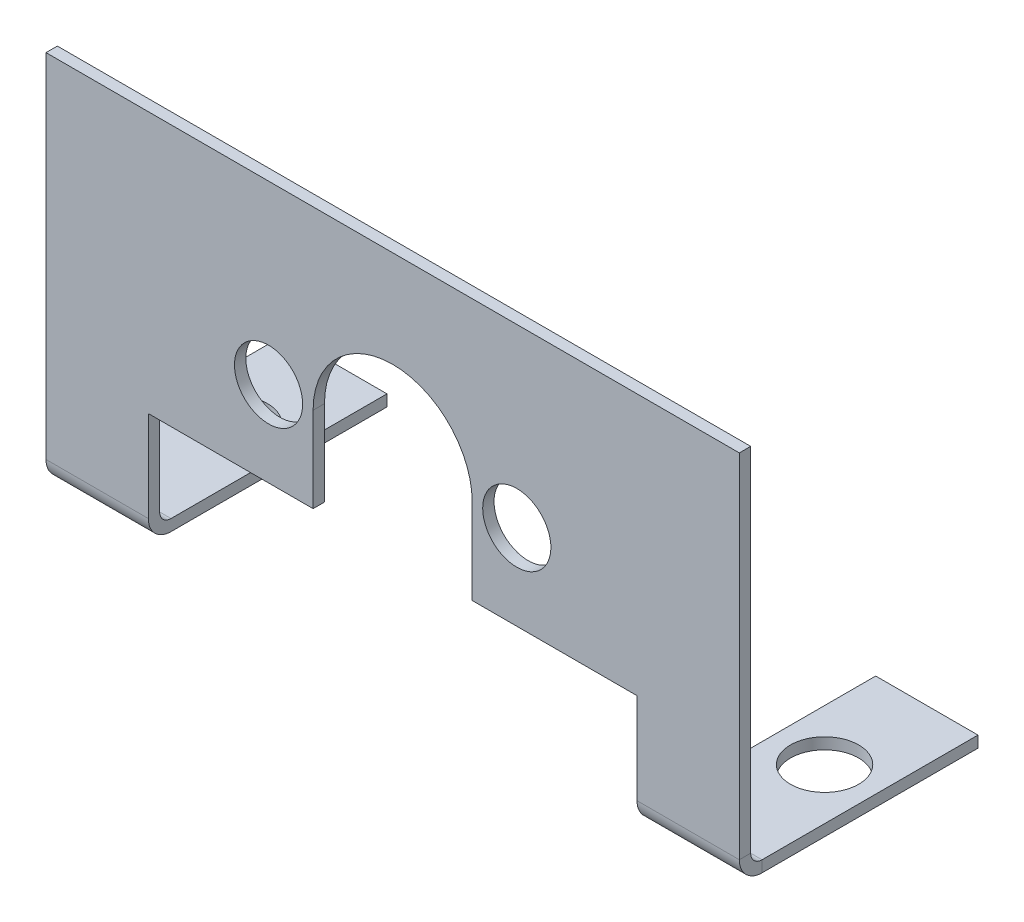
ISO-10303-21;
HEADER;
FILE_DESCRIPTION(('STEP AP214'),'2;1');
FILE_NAME('part.step','',(''),(''),'','','');
FILE_SCHEMA(('AUTOMOTIVE_DESIGN { 1 0 10303 214 1 1 1 1 }'));
ENDSEC;
DATA;
#1=APPLICATION_CONTEXT('core data for automotive mechanical design processes');
#2=APPLICATION_PROTOCOL_DEFINITION('international standard','automotive_design',2000,#1);
#3=PRODUCT_CONTEXT('',#1,'mechanical');
#4=PRODUCT('Part','Part','',(#3));
#5=PRODUCT_RELATED_PRODUCT_CATEGORY('part','',(#4));
#6=PRODUCT_DEFINITION_FORMATION('','',#4);
#7=PRODUCT_DEFINITION_CONTEXT('part definition',#1,'design');
#8=PRODUCT_DEFINITION('design','',#6,#7);
#9=PRODUCT_DEFINITION_SHAPE('','',#8);
#10=(LENGTH_UNIT() NAMED_UNIT(*) SI_UNIT(.MILLI.,.METRE.));
#11=(NAMED_UNIT(*) PLANE_ANGLE_UNIT() SI_UNIT($,.RADIAN.));
#12=(NAMED_UNIT(*) SI_UNIT($,.STERADIAN.) SOLID_ANGLE_UNIT());
#13=UNCERTAINTY_MEASURE_WITH_UNIT(LENGTH_MEASURE(1.E-05),#10,'distance_accuracy_value','');
#14=(GEOMETRIC_REPRESENTATION_CONTEXT(3) GLOBAL_UNCERTAINTY_ASSIGNED_CONTEXT((#13)) GLOBAL_UNIT_ASSIGNED_CONTEXT((#10,
#11,#12)) REPRESENTATION_CONTEXT('',''));
#15=CARTESIAN_POINT('',(0.,0.,0.));
#16=DIRECTION('',(0.,0.,1.));
#17=DIRECTION('',(1.,0.,0.));
#18=AXIS2_PLACEMENT_3D('',#15,#16,#17);
#19=CARTESIAN_POINT('',(30.5,-17.9852622673435,59.7249407783418));
#20=DIRECTION('',(0.,1.,0.));
#21=DIRECTION('',(0.,0.,1.));
#22=AXIS2_PLACEMENT_3D('',#19,#20,#21);
#23=PLANE('',#22);
#24=CARTESIAN_POINT('',(28.25,-17.9852622673435,54.2249407783418));
#25=DIRECTION('',(0.,1.,0.));
#26=DIRECTION('',(0.,0.,1.));
#27=AXIS2_PLACEMENT_3D('',#24,#25,#26);
#28=CIRCLE('',#27,1.5);
#29=CARTESIAN_POINT('',(28.25,-17.9852622673435,55.7249407783418));
#30=VERTEX_POINT('',#29);
#31=EDGE_CURVE('E409',#30,#30,#28,.T.);
#32=ORIENTED_EDGE('',*,*,#31,.T.);
#33=EDGE_LOOP('',(#32));
#34=FACE_BOUND('',#33,.T.);
#35=DIRECTION('',(-1.,0.,0.));
#36=VECTOR('',#35,1.);
#37=CARTESIAN_POINT('',(30.5,-17.9852622673435,59.2249407783418));
#38=LINE('',#37,#36);
#39=CARTESIAN_POINT('',(30.5,-17.9852622673435,59.2249407783418));
#40=VERTEX_POINT('',#39);
#41=CARTESIAN_POINT('',(26.,-17.9852622673435,59.2249407783418));
#42=VERTEX_POINT('',#41);
#43=EDGE_CURVE('E184',#40,#42,#38,.T.);
#44=ORIENTED_EDGE('',*,*,#43,.T.);
#45=DIRECTION('',(0.,0.,1.));
#46=VECTOR('',#45,1.);
#47=CARTESIAN_POINT('',(26.,-17.9852622673435,48.2249407783418));
#48=LINE('',#47,#46);
#49=CARTESIAN_POINT('',(26.,-17.9852622673435,49.7249407783418));
#50=VERTEX_POINT('',#49);
#51=EDGE_CURVE('E450',#50,#42,#48,.T.);
#52=ORIENTED_EDGE('',*,*,#51,.F.);
#53=DIRECTION('',(-1.,0.,0.));
#54=VECTOR('',#53,1.);
#55=CARTESIAN_POINT('',(30.5,-17.9852622673435,49.7249407783418));
#56=LINE('',#55,#54);
#57=CARTESIAN_POINT('',(30.5,-17.9852622673435,49.7249407783418));
#58=VERTEX_POINT('',#57);
#59=EDGE_CURVE('E203',#58,#50,#56,.T.);
#60=ORIENTED_EDGE('',*,*,#59,.F.);
#61=DIRECTION('',(0.,0.,-1.));
#62=VECTOR('',#61,1.);
#63=CARTESIAN_POINT('',(30.5,-17.9852622673435,59.7249407783418));
#64=LINE('',#63,#62);
#65=EDGE_CURVE('E111',#40,#58,#64,.T.);
#66=ORIENTED_EDGE('',*,*,#65,.F.);
#67=EDGE_LOOP('',(#44,#52,#60,#66));
#68=FACE_BOUND('',#67,.T.);
#69=ADVANCED_FACE('F46',(#34,#68),#23,.F.);
#70=CARTESIAN_POINT('',(30.5,-17.4852622673435,49.7249407783418));
#71=DIRECTION('',(0.,0.,-1.));
#72=DIRECTION('',(-1.,0.,0.));
#73=AXIS2_PLACEMENT_3D('',#70,#71,#72);
#74=PLANE('',#73);
#75=DIRECTION('',(0.,-1.,0.));
#76=VECTOR('',#75,1.);
#77=CARTESIAN_POINT('',(26.,-17.4852622673435,49.7249407783418));
#78=LINE('',#77,#76);
#79=CARTESIAN_POINT('',(26.,-17.4852622673435,49.7249407783418));
#80=VERTEX_POINT('',#79);
#81=EDGE_CURVE('E262',#80,#50,#78,.T.);
#82=ORIENTED_EDGE('',*,*,#81,.F.);
#83=DIRECTION('',(-1.,0.,0.));
#84=VECTOR('',#83,1.);
#85=CARTESIAN_POINT('',(30.5,-17.4852622673435,49.7249407783418));
#86=LINE('',#85,#84);
#87=CARTESIAN_POINT('',(30.5,-17.4852622673435,49.7249407783418));
#88=VERTEX_POINT('',#87);
#89=EDGE_CURVE('E199',#88,#80,#86,.T.);
#90=ORIENTED_EDGE('',*,*,#89,.F.);
#91=DIRECTION('',(0.,-1.,0.));
#92=VECTOR('',#91,1.);
#93=CARTESIAN_POINT('',(30.5,-17.4852622673435,49.7249407783418));
#94=LINE('',#93,#92);
#95=EDGE_CURVE('E286',#88,#58,#94,.T.);
#96=ORIENTED_EDGE('',*,*,#95,.T.);
#97=ORIENTED_EDGE('',*,*,#59,.T.);
#98=EDGE_LOOP('',(#82,#90,#96,#97));
#99=FACE_BOUND('',#98,.T.);
#100=ADVANCED_FACE('F320',(#99),#74,.T.);
#101=CARTESIAN_POINT('',(30.5,-17.4852622673435,59.7249407783418));
#102=DIRECTION('',(0.,1.,0.));
#103=DIRECTION('',(0.,0.,1.));
#104=AXIS2_PLACEMENT_3D('',#101,#102,#103);
#105=PLANE('',#104);
#106=CARTESIAN_POINT('',(28.25,-17.4852622673435,54.2249407783418));
#107=DIRECTION('',(0.,1.,0.));
#108=DIRECTION('',(0.,0.,1.));
#109=AXIS2_PLACEMENT_3D('',#106,#107,#108);
#110=CIRCLE('',#109,1.5);
#111=CARTESIAN_POINT('',(28.25,-17.4852622673435,55.7249407783418));
#112=VERTEX_POINT('',#111);
#113=EDGE_CURVE('E406',#112,#112,#110,.T.);
#114=ORIENTED_EDGE('',*,*,#113,.F.);
#115=EDGE_LOOP('',(#114));
#116=FACE_BOUND('',#115,.T.);
#117=DIRECTION('',(0.,0.,-1.));
#118=VECTOR('',#117,1.);
#119=CARTESIAN_POINT('',(26.,-17.4852622673435,59.7249407783418));
#120=LINE('',#119,#118);
#121=CARTESIAN_POINT('',(26.,-17.4852622673435,59.2249407783418));
#122=VERTEX_POINT('',#121);
#123=EDGE_CURVE('E259',#122,#80,#120,.T.);
#124=ORIENTED_EDGE('',*,*,#123,.F.);
#125=DIRECTION('',(-1.,0.,0.));
#126=VECTOR('',#125,1.);
#127=CARTESIAN_POINT('',(30.5,-17.4852622673435,59.2249407783418));
#128=LINE('',#127,#126);
#129=CARTESIAN_POINT('',(30.5,-17.4852622673435,59.2249407783418));
#130=VERTEX_POINT('',#129);
#131=EDGE_CURVE('E195',#130,#122,#128,.T.);
#132=ORIENTED_EDGE('',*,*,#131,.F.);
#133=DIRECTION('',(0.,0.,-1.));
#134=VECTOR('',#133,1.);
#135=CARTESIAN_POINT('',(30.5,-17.4852622673435,59.7249407783418));
#136=LINE('',#135,#134);
#137=EDGE_CURVE('E289',#130,#88,#136,.T.);
#138=ORIENTED_EDGE('',*,*,#137,.T.);
#139=ORIENTED_EDGE('',*,*,#89,.T.);
#140=EDGE_LOOP('',(#124,#132,#138,#139));
#141=FACE_BOUND('',#140,.T.);
#142=ADVANCED_FACE('F325',(#116,#141),#105,.T.);
#143=CARTESIAN_POINT('',(30.5,-16.9852622673435,59.2249407783418));
#144=DIRECTION('',(-1.,0.,0.));
#145=DIRECTION('',(0.,0.,1.));
#146=AXIS2_PLACEMENT_3D('',#143,#144,#145);
#147=CYLINDRICAL_SURFACE('',#146,0.5);
#148=CARTESIAN_POINT('',(26.,-16.9852622673435,59.2249407783418));
#149=DIRECTION('',(1.,0.,0.));
#150=DIRECTION('',(0.,1.,0.));
#151=AXIS2_PLACEMENT_3D('',#148,#149,#150);
#152=CIRCLE('',#151,0.5);
#153=CARTESIAN_POINT('',(26.,-16.9852622673435,59.7249407783418));
#154=VERTEX_POINT('',#153);
#155=EDGE_CURVE('E251',#154,#122,#152,.T.);
#156=ORIENTED_EDGE('',*,*,#155,.F.);
#157=DIRECTION('',(-1.,0.,0.));
#158=VECTOR('',#157,1.);
#159=CARTESIAN_POINT('',(30.5,-16.9852622673435,59.7249407783418));
#160=LINE('',#159,#158);
#161=CARTESIAN_POINT('',(30.5,-16.9852622673435,59.7249407783418));
#162=VERTEX_POINT('',#161);
#163=EDGE_CURVE('E191',#162,#154,#160,.T.);
#164=ORIENTED_EDGE('',*,*,#163,.F.);
#165=CARTESIAN_POINT('',(30.5,-16.9852622673435,59.2249407783418));
#166=DIRECTION('',(-1.,0.,0.));
#167=DIRECTION('',(0.,0.,1.));
#168=AXIS2_PLACEMENT_3D('',#165,#166,#167);
#169=CIRCLE('',#168,0.5);
#170=EDGE_CURVE('E158',#162,#130,#169,.F.);
#171=ORIENTED_EDGE('',*,*,#170,.T.);
#172=ORIENTED_EDGE('',*,*,#131,.T.);
#173=EDGE_LOOP('',(#156,#164,#171,#172));
#174=FACE_BOUND('',#173,.T.);
#175=ADVANCED_FACE('F296',(#174),#147,.F.);
#176=CARTESIAN_POINT('',(30.5,-16.9852622673435,59.2249407783418));
#177=DIRECTION('',(-1.,0.,0.));
#178=DIRECTION('',(0.,0.,1.));
#179=AXIS2_PLACEMENT_3D('',#176,#177,#178);
#180=CYLINDRICAL_SURFACE('',#179,1.);
#181=DIRECTION('',(-1.,0.,0.));
#182=VECTOR('',#181,1.);
#183=CARTESIAN_POINT('',(30.5,-16.9852622673435,60.2249407783418));
#184=LINE('',#183,#182);
#185=CARTESIAN_POINT('',(30.5,-16.9852622673435,60.2249407783418));
#186=VERTEX_POINT('',#185);
#187=CARTESIAN_POINT('',(26.,-16.9852622673435,60.2249407783418));
#188=VERTEX_POINT('',#187);
#189=EDGE_CURVE('E140',#186,#188,#184,.T.);
#190=ORIENTED_EDGE('',*,*,#189,.T.);
#191=CARTESIAN_POINT('',(26.,-16.9852622673435,59.2249407783418));
#192=DIRECTION('',(1.,0.,0.));
#193=DIRECTION('',(0.,1.,0.));
#194=AXIS2_PLACEMENT_3D('',#191,#192,#193);
#195=CIRCLE('',#194,1.);
#196=EDGE_CURVE('E13',#188,#42,#195,.T.);
#197=ORIENTED_EDGE('',*,*,#196,.T.);
#198=ORIENTED_EDGE('',*,*,#43,.F.);
#199=CARTESIAN_POINT('',(30.5,-16.9852622673435,59.2249407783418));
#200=DIRECTION('',(1.,0.,0.));
#201=DIRECTION('',(0.,0.,-1.));
#202=AXIS2_PLACEMENT_3D('',#199,#200,#201);
#203=CIRCLE('',#202,1.);
#204=EDGE_CURVE('E151',#186,#40,#203,.T.);
#205=ORIENTED_EDGE('',*,*,#204,.F.);
#206=EDGE_LOOP('',(#190,#197,#198,#205));
#207=FACE_BOUND('',#206,.T.);
#208=ADVANCED_FACE('F350',(#207),#180,.T.);
#209=CARTESIAN_POINT('',(30.5,-17.4852622673435,59.2249407783418));
#210=DIRECTION('',(1.,0.,0.));
#211=DIRECTION('',(0.,0.,-1.));
#212=AXIS2_PLACEMENT_3D('',#209,#210,#211);
#213=PLANE('',#212);
#214=DIRECTION('',(0.,-1.,0.));
#215=VECTOR('',#214,1.);
#216=CARTESIAN_POINT('',(30.5,-17.4852622673435,59.2249407783418));
#217=LINE('',#216,#215);
#218=EDGE_CURVE('E70',#130,#40,#217,.T.);
#219=ORIENTED_EDGE('',*,*,#218,.F.);
#220=ORIENTED_EDGE('',*,*,#170,.F.);
#221=DIRECTION('',(0.,0.,-1.));
#222=VECTOR('',#221,1.);
#223=CARTESIAN_POINT('',(30.5,-16.9852622673435,60.2249407783418));
#224=LINE('',#223,#222);
#225=EDGE_CURVE('E212',#186,#162,#224,.T.);
#226=ORIENTED_EDGE('',*,*,#225,.F.);
#227=ORIENTED_EDGE('',*,*,#204,.T.);
#228=EDGE_LOOP('',(#219,#220,#226,#227));
#229=FACE_BOUND('',#228,.T.);
#230=ADVANCED_FACE('F48',(#229),#213,.T.);
#231=CARTESIAN_POINT('',(30.5,-16.9852622673435,60.2249407783418));
#232=DIRECTION('',(1.,0.,0.));
#233=DIRECTION('',(0.,0.,-1.));
#234=AXIS2_PLACEMENT_3D('',#231,#232,#233);
#235=PLANE('',#234);
#236=ORIENTED_EDGE('',*,*,#137,.F.);
#237=ORIENTED_EDGE('',*,*,#218,.T.);
#238=ORIENTED_EDGE('',*,*,#65,.T.);
#239=ORIENTED_EDGE('',*,*,#95,.F.);
#240=EDGE_LOOP('',(#236,#237,#238,#239));
#241=FACE_BOUND('',#240,.T.);
#242=ADVANCED_FACE('F317',(#241),#235,.T.);
#243=CARTESIAN_POINT('',(0.,-16.9852622673435,59.7249407783418));
#244=DIRECTION('',(-1.,0.,0.));
#245=DIRECTION('',(0.,0.,1.));
#246=AXIS2_PLACEMENT_3D('',#243,#244,#245);
#247=PLANE('',#246);
#248=DIRECTION('',(0.,0.,1.));
#249=VECTOR('',#248,1.);
#250=CARTESIAN_POINT('',(0.,-16.9852622673435,59.7249407783418));
#251=LINE('',#250,#249);
#252=CARTESIAN_POINT('',(0.,-16.9852622673435,59.7249407783418));
#253=VERTEX_POINT('',#252);
#254=CARTESIAN_POINT('',(0.,-16.9852622673435,60.2249407783418));
#255=VERTEX_POINT('',#254);
#256=EDGE_CURVE('E209',#253,#255,#251,.T.);
#257=ORIENTED_EDGE('',*,*,#256,.F.);
#258=CARTESIAN_POINT('',(0.,-16.9852622673435,59.2249407783418));
#259=DIRECTION('',(-1.,0.,0.));
#260=DIRECTION('',(0.,0.,1.));
#261=AXIS2_PLACEMENT_3D('',#258,#259,#260);
#262=CIRCLE('',#261,0.5);
#263=CARTESIAN_POINT('',(0.,-17.4852622673435,59.2249407783418));
#264=VERTEX_POINT('',#263);
#265=EDGE_CURVE('E172',#253,#264,#262,.F.);
#266=ORIENTED_EDGE('',*,*,#265,.T.);
#267=DIRECTION('',(0.,1.,0.));
#268=VECTOR('',#267,1.);
#269=CARTESIAN_POINT('',(0.,-17.9852622673435,59.2249407783418));
#270=LINE('',#269,#268);
#271=CARTESIAN_POINT('',(0.,-17.9852622673435,59.2249407783418));
#272=VERTEX_POINT('',#271);
#273=EDGE_CURVE('E206',#272,#264,#270,.T.);
#274=ORIENTED_EDGE('',*,*,#273,.F.);
#275=CARTESIAN_POINT('',(0.,-16.9852622673435,59.2249407783418));
#276=DIRECTION('',(1.,0.,0.));
#277=DIRECTION('',(0.,0.,-1.));
#278=AXIS2_PLACEMENT_3D('',#275,#276,#277);
#279=CIRCLE('',#278,1.);
#280=EDGE_CURVE('E181',#255,#272,#279,.T.);
#281=ORIENTED_EDGE('',*,*,#280,.F.);
#282=EDGE_LOOP('',(#257,#266,#274,#281));
#283=FACE_BOUND('',#282,.T.);
#284=ADVANCED_FACE('F225',(#283),#247,.T.);
#285=CARTESIAN_POINT('',(0.,-17.9852622673435,59.2249407783418));
#286=DIRECTION('',(-1.,0.,0.));
#287=DIRECTION('',(0.,0.,1.));
#288=AXIS2_PLACEMENT_3D('',#285,#286,#287);
#289=PLANE('',#288);
#290=DIRECTION('',(0.,-1.,0.));
#291=VECTOR('',#290,1.);
#292=CARTESIAN_POINT('',(0.,-1.48526226734347,59.7249407783418));
#293=LINE('',#292,#291);
#294=CARTESIAN_POINT('',(0.,-1.48526226734347,59.7249407783418));
#295=VERTEX_POINT('',#294);
#296=EDGE_CURVE('E175',#295,#253,#293,.T.);
#297=ORIENTED_EDGE('',*,*,#296,.T.);
#298=ORIENTED_EDGE('',*,*,#256,.T.);
#299=DIRECTION('',(0.,-1.,0.));
#300=VECTOR('',#299,1.);
#301=CARTESIAN_POINT('',(0.,-1.48526226734347,60.2249407783418));
#302=LINE('',#301,#300);
#303=CARTESIAN_POINT('',(0.,-1.48526226734347,60.2249407783418));
#304=VERTEX_POINT('',#303);
#305=EDGE_CURVE('E179',#304,#255,#302,.T.);
#306=ORIENTED_EDGE('',*,*,#305,.F.);
#307=DIRECTION('',(0.,0.,-1.));
#308=VECTOR('',#307,1.);
#309=CARTESIAN_POINT('',(0.,-1.48526226734347,60.2249407783418));
#310=LINE('',#309,#308);
#311=EDGE_CURVE('E135',#304,#295,#310,.T.);
#312=ORIENTED_EDGE('',*,*,#311,.T.);
#313=EDGE_LOOP('',(#297,#298,#306,#312));
#314=FACE_BOUND('',#313,.T.);
#315=ADVANCED_FACE('F308',(#314),#289,.T.);
#316=CARTESIAN_POINT('',(2.25,-17.9852622673435,54.2249407783418));
#317=DIRECTION('',(0.,1.,0.));
#318=DIRECTION('',(0.,0.,1.));
#319=AXIS2_PLACEMENT_3D('',#316,#317,#318);
#320=CIRCLE('',#319,1.5);
#321=CARTESIAN_POINT('',(2.25,-17.9852622673435,55.7249407783418));
#322=VERTEX_POINT('',#321);
#323=EDGE_CURVE('E405',#322,#322,#320,.T.);
#324=ORIENTED_EDGE('',*,*,#323,.T.);
#325=EDGE_LOOP('',(#324));
#326=FACE_BOUND('',#325,.T.);
#327=CARTESIAN_POINT('',(4.5,-17.9852622673435,49.7249407783418));
#328=VERTEX_POINT('',#327);
#329=CARTESIAN_POINT('',(0.,-17.9852622673435,49.7249407783418));
#330=VERTEX_POINT('',#329);
#331=EDGE_CURVE('E202',#328,#330,#56,.T.);
#332=ORIENTED_EDGE('',*,*,#331,.F.);
#333=DIRECTION('',(0.,0.,1.));
#334=VECTOR('',#333,1.);
#335=CARTESIAN_POINT('',(4.5,-17.9852622673435,48.2249407783418));
#336=LINE('',#335,#334);
#337=CARTESIAN_POINT('',(4.5,-17.9852622673435,59.2249407783418));
#338=VERTEX_POINT('',#337);
#339=EDGE_CURVE('E235',#328,#338,#336,.T.);
#340=ORIENTED_EDGE('',*,*,#339,.T.);
#341=EDGE_CURVE('E105',#338,#272,#38,.T.);
#342=ORIENTED_EDGE('',*,*,#341,.T.);
#343=DIRECTION('',(0.,0.,-1.));
#344=VECTOR('',#343,1.);
#345=CARTESIAN_POINT('',(0.,-17.9852622673435,59.7249407783418));
#346=LINE('',#345,#344);
#347=EDGE_CURVE('E163',#272,#330,#346,.T.);
#348=ORIENTED_EDGE('',*,*,#347,.T.);
#349=EDGE_LOOP('',(#332,#340,#342,#348));
#350=FACE_BOUND('',#349,.T.);
#351=ADVANCED_FACE('F233',(#326,#350),#23,.F.);
#352=DIRECTION('',(0.,1.,0.));
#353=VECTOR('',#352,1.);
#354=CARTESIAN_POINT('',(4.5,-17.4852622673435,49.7249407783418));
#355=LINE('',#354,#353);
#356=CARTESIAN_POINT('',(4.5,-17.4852622673435,49.7249407783418));
#357=VERTEX_POINT('',#356);
#358=EDGE_CURVE('E243',#328,#357,#355,.T.);
#359=ORIENTED_EDGE('',*,*,#358,.F.);
#360=ORIENTED_EDGE('',*,*,#331,.T.);
#361=DIRECTION('',(0.,-1.,0.));
#362=VECTOR('',#361,1.);
#363=CARTESIAN_POINT('',(0.,-17.4852622673435,49.7249407783418));
#364=LINE('',#363,#362);
#365=CARTESIAN_POINT('',(0.,-17.4852622673435,49.7249407783418));
#366=VERTEX_POINT('',#365);
#367=EDGE_CURVE('E165',#366,#330,#364,.T.);
#368=ORIENTED_EDGE('',*,*,#367,.F.);
#369=EDGE_CURVE('E198',#357,#366,#86,.T.);
#370=ORIENTED_EDGE('',*,*,#369,.F.);
#371=EDGE_LOOP('',(#359,#360,#368,#370));
#372=FACE_BOUND('',#371,.T.);
#373=ADVANCED_FACE('F240',(#372),#74,.T.);
#374=CARTESIAN_POINT('',(2.25,-17.4852622673435,54.2249407783418));
#375=DIRECTION('',(0.,1.,0.));
#376=DIRECTION('',(0.,0.,-1.));
#377=AXIS2_PLACEMENT_3D('',#374,#375,#376);
#378=CIRCLE('',#377,1.5);
#379=CARTESIAN_POINT('',(2.25,-17.4852622673435,52.7249407783418));
#380=VERTEX_POINT('',#379);
#381=EDGE_CURVE('E402',#380,#380,#378,.T.);
#382=ORIENTED_EDGE('',*,*,#381,.F.);
#383=EDGE_LOOP('',(#382));
#384=FACE_BOUND('',#383,.T.);
#385=DIRECTION('',(0.,0.,1.));
#386=VECTOR('',#385,1.);
#387=CARTESIAN_POINT('',(4.5,-17.4852622673435,59.7249407783418));
#388=LINE('',#387,#386);
#389=CARTESIAN_POINT('',(4.5,-17.4852622673435,59.2249407783418));
#390=VERTEX_POINT('',#389);
#391=EDGE_CURVE('E248',#357,#390,#388,.T.);
#392=ORIENTED_EDGE('',*,*,#391,.F.);
#393=ORIENTED_EDGE('',*,*,#369,.T.);
#394=DIRECTION('',(0.,0.,-1.));
#395=VECTOR('',#394,1.);
#396=CARTESIAN_POINT('',(0.,-17.4852622673435,59.7249407783418));
#397=LINE('',#396,#395);
#398=EDGE_CURVE('E169',#264,#366,#397,.T.);
#399=ORIENTED_EDGE('',*,*,#398,.F.);
#400=EDGE_CURVE('E194',#390,#264,#128,.T.);
#401=ORIENTED_EDGE('',*,*,#400,.F.);
#402=EDGE_LOOP('',(#392,#393,#399,#401));
#403=FACE_BOUND('',#402,.T.);
#404=ADVANCED_FACE('F332',(#384,#403),#105,.T.);
#405=CARTESIAN_POINT('',(4.5,-16.9852622673435,59.2249407783418));
#406=DIRECTION('',(-1.,0.,0.));
#407=DIRECTION('',(0.,-1.,0.));
#408=AXIS2_PLACEMENT_3D('',#405,#406,#407);
#409=CIRCLE('',#408,0.5);
#410=CARTESIAN_POINT('',(4.5,-16.9852622673435,59.7249407783418));
#411=VERTEX_POINT('',#410);
#412=EDGE_CURVE('E253',#390,#411,#409,.T.);
#413=ORIENTED_EDGE('',*,*,#412,.F.);
#414=ORIENTED_EDGE('',*,*,#400,.T.);
#415=ORIENTED_EDGE('',*,*,#265,.F.);
#416=EDGE_CURVE('E190',#411,#253,#160,.T.);
#417=ORIENTED_EDGE('',*,*,#416,.F.);
#418=EDGE_LOOP('',(#413,#414,#415,#417));
#419=FACE_BOUND('',#418,.T.);
#420=ADVANCED_FACE('F335',(#419),#147,.F.);
#421=CARTESIAN_POINT('',(30.5,-1.48526226734347,59.7249407783418));
#422=DIRECTION('',(0.,0.,-1.));
#423=DIRECTION('',(0.,1.,0.));
#424=AXIS2_PLACEMENT_3D('',#421,#422,#423);
#425=PLANE('',#424);
#426=CARTESIAN_POINT('',(20.71,-9.23526226734347,59.7249407783418));
#427=DIRECTION('',(0.,0.,-1.));
#428=DIRECTION('',(0.,1.,0.));
#429=AXIS2_PLACEMENT_3D('',#426,#427,#428);
#430=CIRCLE('',#429,1.5);
#431=CARTESIAN_POINT('',(20.71,-7.73526226734347,59.7249407783418));
#432=VERTEX_POINT('',#431);
#433=EDGE_CURVE('E417',#432,#432,#430,.T.);
#434=ORIENTED_EDGE('',*,*,#433,.F.);
#435=EDGE_LOOP('',(#434));
#436=FACE_BOUND('',#435,.T.);
#437=DIRECTION('',(0.,-1.,0.));
#438=VECTOR('',#437,1.);
#439=CARTESIAN_POINT('',(26.,-1.48526226734346,59.7249407783418));
#440=LINE('',#439,#438);
#441=CARTESIAN_POINT('',(26.,-12.9852622673435,59.7249407783418));
#442=VERTEX_POINT('',#441);
#443=EDGE_CURVE('E247',#442,#154,#440,.T.);
#444=ORIENTED_EDGE('',*,*,#443,.F.);
#445=DIRECTION('',(1.,0.,0.));
#446=VECTOR('',#445,1.);
#447=CARTESIAN_POINT('',(30.5,-12.9852622673435,59.7249407783418));
#448=LINE('',#447,#446);
#449=CARTESIAN_POINT('',(18.75,-12.9852622673435,59.7249407783418));
#450=VERTEX_POINT('',#449);
#451=EDGE_CURVE('E271',#450,#442,#448,.T.);
#452=ORIENTED_EDGE('',*,*,#451,.F.);
#453=DIRECTION('',(0.,-1.,0.));
#454=VECTOR('',#453,1.);
#455=CARTESIAN_POINT('',(18.75,-1.48526226734347,59.7249407783418));
#456=LINE('',#455,#454);
#457=CARTESIAN_POINT('',(18.75,-9.23526226734347,59.7249407783418));
#458=VERTEX_POINT('',#457);
#459=EDGE_CURVE('E274',#458,#450,#456,.T.);
#460=ORIENTED_EDGE('',*,*,#459,.F.);
#461=CARTESIAN_POINT('',(15.25,-9.23526226734347,59.7249407783418));
#462=DIRECTION('',(0.,0.,-1.));
#463=DIRECTION('',(0.,1.,0.));
#464=AXIS2_PLACEMENT_3D('',#461,#462,#463);
#465=CIRCLE('',#464,3.5);
#466=CARTESIAN_POINT('',(11.75,-9.23526226734347,59.7249407783418));
#467=VERTEX_POINT('',#466);
#468=EDGE_CURVE('E277',#467,#458,#465,.T.);
#469=ORIENTED_EDGE('',*,*,#468,.F.);
#470=DIRECTION('',(0.,1.,0.));
#471=VECTOR('',#470,1.);
#472=CARTESIAN_POINT('',(11.75,-1.48526226734347,59.7249407783418));
#473=LINE('',#472,#471);
#474=CARTESIAN_POINT('',(11.75,-12.9852622673435,59.7249407783418));
#475=VERTEX_POINT('',#474);
#476=EDGE_CURVE('E265',#475,#467,#473,.T.);
#477=ORIENTED_EDGE('',*,*,#476,.F.);
#478=DIRECTION('',(1.,0.,0.));
#479=VECTOR('',#478,1.);
#480=CARTESIAN_POINT('',(30.5,-12.9852622673435,59.7249407783418));
#481=LINE('',#480,#479);
#482=CARTESIAN_POINT('',(4.5,-12.9852622673435,59.7249407783418));
#483=VERTEX_POINT('',#482);
#484=EDGE_CURVE('E268',#483,#475,#481,.T.);
#485=ORIENTED_EDGE('',*,*,#484,.F.);
#486=DIRECTION('',(0.,1.,0.));
#487=VECTOR('',#486,1.);
#488=CARTESIAN_POINT('',(4.49999999999999,-1.48526226734347,59.7249407783418));
#489=LINE('',#488,#487);
#490=EDGE_CURVE('E443',#411,#483,#489,.T.);
#491=ORIENTED_EDGE('',*,*,#490,.F.);
#492=ORIENTED_EDGE('',*,*,#416,.T.);
#493=ORIENTED_EDGE('',*,*,#296,.F.);
#494=DIRECTION('',(-1.,0.,0.));
#495=VECTOR('',#494,1.);
#496=CARTESIAN_POINT('',(30.5,-1.48526226734347,59.7249407783418));
#497=LINE('',#496,#495);
#498=CARTESIAN_POINT('',(30.5,-1.48526226734347,59.7249407783418));
#499=VERTEX_POINT('',#498);
#500=EDGE_CURVE('E139',#499,#295,#497,.T.);
#501=ORIENTED_EDGE('',*,*,#500,.F.);
#502=DIRECTION('',(0.,-1.,0.));
#503=VECTOR('',#502,1.);
#504=CARTESIAN_POINT('',(30.5,-1.48526226734347,59.7249407783418));
#505=LINE('',#504,#503);
#506=EDGE_CURVE('E156',#499,#162,#505,.T.);
#507=ORIENTED_EDGE('',*,*,#506,.T.);
#508=ORIENTED_EDGE('',*,*,#163,.T.);
#509=EDGE_LOOP('',(#444,#452,#460,#469,#477,#485,#491,#492,#493,#501,#507,#508));
#510=FACE_BOUND('',#509,.T.);
#511=CARTESIAN_POINT('',(9.79,-9.23526226734347,59.7249407783418));
#512=DIRECTION('',(0.,0.,-1.));
#513=DIRECTION('',(0.,1.,0.));
#514=AXIS2_PLACEMENT_3D('',#511,#512,#513);
#515=CIRCLE('',#514,1.5);
#516=CARTESIAN_POINT('',(9.79,-7.73526226734347,59.7249407783418));
#517=VERTEX_POINT('',#516);
#518=EDGE_CURVE('E166',#517,#517,#515,.T.);
#519=ORIENTED_EDGE('',*,*,#518,.F.);
#520=EDGE_LOOP('',(#519));
#521=FACE_BOUND('',#520,.T.);
#522=ADVANCED_FACE('F302',(#436,#510,#521),#425,.T.);
#523=CARTESIAN_POINT('',(30.5,-1.48526226734347,60.2249407783418));
#524=DIRECTION('',(0.,1.,0.));
#525=DIRECTION('',(0.,0.,1.));
#526=AXIS2_PLACEMENT_3D('',#523,#524,#525);
#527=PLANE('',#526);
#528=ORIENTED_EDGE('',*,*,#311,.F.);
#529=DIRECTION('',(-1.,0.,0.));
#530=VECTOR('',#529,1.);
#531=CARTESIAN_POINT('',(30.5,-1.48526226734347,60.2249407783418));
#532=LINE('',#531,#530);
#533=CARTESIAN_POINT('',(30.5,-1.48526226734347,60.2249407783418));
#534=VERTEX_POINT('',#533);
#535=EDGE_CURVE('E129',#534,#304,#532,.T.);
#536=ORIENTED_EDGE('',*,*,#535,.F.);
#537=DIRECTION('',(0.,0.,-1.));
#538=VECTOR('',#537,1.);
#539=CARTESIAN_POINT('',(30.5,-1.48526226734347,60.2249407783418));
#540=LINE('',#539,#538);
#541=EDGE_CURVE('E133',#534,#499,#540,.T.);
#542=ORIENTED_EDGE('',*,*,#541,.T.);
#543=ORIENTED_EDGE('',*,*,#500,.T.);
#544=EDGE_LOOP('',(#528,#536,#542,#543));
#545=FACE_BOUND('',#544,.T.);
#546=ADVANCED_FACE('F131',(#545),#527,.T.);
#547=CARTESIAN_POINT('',(30.5,-1.48526226734347,60.2249407783418));
#548=DIRECTION('',(0.,0.,-1.));
#549=DIRECTION('',(0.,1.,0.));
#550=AXIS2_PLACEMENT_3D('',#547,#548,#549);
#551=PLANE('',#550);
#552=CARTESIAN_POINT('',(20.71,-9.23526226734347,60.2249407783418));
#553=DIRECTION('',(0.,0.,1.));
#554=DIRECTION('',(-1.,0.,0.));
#555=AXIS2_PLACEMENT_3D('',#552,#553,#554);
#556=CIRCLE('',#555,1.5);
#557=CARTESIAN_POINT('',(19.21,-9.23526226734347,60.2249407783418));
#558=VERTEX_POINT('',#557);
#559=EDGE_CURVE('E414',#558,#558,#556,.T.);
#560=ORIENTED_EDGE('',*,*,#559,.F.);
#561=EDGE_LOOP('',(#560));
#562=FACE_BOUND('',#561,.T.);
#563=CARTESIAN_POINT('',(9.79,-9.23526226734347,60.2249407783418));
#564=DIRECTION('',(0.,0.,1.));
#565=DIRECTION('',(1.,0.,0.));
#566=AXIS2_PLACEMENT_3D('',#563,#564,#565);
#567=CIRCLE('',#566,1.5);
#568=CARTESIAN_POINT('',(11.29,-9.23526226734347,60.2249407783418));
#569=VERTEX_POINT('',#568);
#570=EDGE_CURVE('E280',#569,#569,#567,.T.);
#571=ORIENTED_EDGE('',*,*,#570,.F.);
#572=EDGE_LOOP('',(#571));
#573=FACE_BOUND('',#572,.T.);
#574=DIRECTION('',(-1.,0.,0.));
#575=VECTOR('',#574,1.);
#576=CARTESIAN_POINT('',(18.75,-12.9852622673435,60.2249407783418));
#577=LINE('',#576,#575);
#578=CARTESIAN_POINT('',(26.,-12.9852622673435,60.2249407783418));
#579=VERTEX_POINT('',#578);
#580=CARTESIAN_POINT('',(18.75,-12.9852622673435,60.2249407783418));
#581=VERTEX_POINT('',#580);
#582=EDGE_CURVE('E433',#579,#581,#577,.T.);
#583=ORIENTED_EDGE('',*,*,#582,.F.);
#584=DIRECTION('',(0.,1.,0.));
#585=VECTOR('',#584,1.);
#586=CARTESIAN_POINT('',(26.,-12.9852622673435,60.2249407783418));
#587=LINE('',#586,#585);
#588=EDGE_CURVE('E430',#188,#579,#587,.T.);
#589=ORIENTED_EDGE('',*,*,#588,.F.);
#590=ORIENTED_EDGE('',*,*,#189,.F.);
#591=DIRECTION('',(0.,-1.,0.));
#592=VECTOR('',#591,1.);
#593=CARTESIAN_POINT('',(30.5,-1.48526226734347,60.2249407783418));
#594=LINE('',#593,#592);
#595=EDGE_CURVE('E144',#534,#186,#594,.T.);
#596=ORIENTED_EDGE('',*,*,#595,.F.);
#597=ORIENTED_EDGE('',*,*,#535,.T.);
#598=ORIENTED_EDGE('',*,*,#305,.T.);
#599=CARTESIAN_POINT('',(4.50000000000001,-16.9852622673435,60.2249407783418));
#600=VERTEX_POINT('',#599);
#601=EDGE_CURVE('E187',#600,#255,#184,.T.);
#602=ORIENTED_EDGE('',*,*,#601,.F.);
#603=DIRECTION('',(0.,-1.,0.));
#604=VECTOR('',#603,1.);
#605=CARTESIAN_POINT('',(4.5,-12.9852622673435,60.2249407783418));
#606=LINE('',#605,#604);
#607=CARTESIAN_POINT('',(4.5,-12.9852622673435,60.2249407783418));
#608=VERTEX_POINT('',#607);
#609=EDGE_CURVE('E61',#608,#600,#606,.T.);
#610=ORIENTED_EDGE('',*,*,#609,.F.);
#611=DIRECTION('',(-1.,0.,0.));
#612=VECTOR('',#611,1.);
#613=CARTESIAN_POINT('',(11.75,-12.9852622673435,60.2249407783418));
#614=LINE('',#613,#612);
#615=CARTESIAN_POINT('',(11.75,-12.9852622673435,60.2249407783418));
#616=VERTEX_POINT('',#615);
#617=EDGE_CURVE('E426',#616,#608,#614,.T.);
#618=ORIENTED_EDGE('',*,*,#617,.F.);
#619=DIRECTION('',(0.,-1.,0.));
#620=VECTOR('',#619,1.);
#621=CARTESIAN_POINT('',(11.75,-9.23526226734347,60.2249407783418));
#622=LINE('',#621,#620);
#623=CARTESIAN_POINT('',(11.75,-9.23526226734347,60.2249407783418));
#624=VERTEX_POINT('',#623);
#625=EDGE_CURVE('E423',#624,#616,#622,.T.);
#626=ORIENTED_EDGE('',*,*,#625,.F.);
#627=CARTESIAN_POINT('',(15.25,-9.23526226734347,60.2249407783418));
#628=DIRECTION('',(0.,0.,1.));
#629=DIRECTION('',(1.,0.,0.));
#630=AXIS2_PLACEMENT_3D('',#627,#628,#629);
#631=CIRCLE('',#630,3.5);
#632=CARTESIAN_POINT('',(18.75,-9.23526226734347,60.2249407783418));
#633=VERTEX_POINT('',#632);
#634=EDGE_CURVE('E420',#633,#624,#631,.T.);
#635=ORIENTED_EDGE('',*,*,#634,.F.);
#636=DIRECTION('',(0.,1.,0.));
#637=VECTOR('',#636,1.);
#638=CARTESIAN_POINT('',(18.75,-12.9852622673435,60.2249407783418));
#639=LINE('',#638,#637);
#640=EDGE_CURVE('E436',#581,#633,#639,.T.);
#641=ORIENTED_EDGE('',*,*,#640,.F.);
#642=EDGE_LOOP('',(#583,#589,#590,#596,#597,#598,#602,#610,#618,#626,#635,#641));
#643=FACE_BOUND('',#642,.T.);
#644=ADVANCED_FACE('F146',(#562,#573,#643),#551,.F.);
#645=ORIENTED_EDGE('',*,*,#341,.F.);
#646=CARTESIAN_POINT('',(4.5,-16.9852622673435,59.2249407783418));
#647=DIRECTION('',(-1.,0.,0.));
#648=DIRECTION('',(0.,-1.,0.));
#649=AXIS2_PLACEMENT_3D('',#646,#647,#648);
#650=CIRCLE('',#649,1.);
#651=EDGE_CURVE('E54',#338,#600,#650,.T.);
#652=ORIENTED_EDGE('',*,*,#651,.T.);
#653=ORIENTED_EDGE('',*,*,#601,.T.);
#654=ORIENTED_EDGE('',*,*,#280,.T.);
#655=EDGE_LOOP('',(#645,#652,#653,#654));
#656=FACE_BOUND('',#655,.T.);
#657=ADVANCED_FACE('F216',(#656),#180,.T.);
#658=CARTESIAN_POINT('',(30.5,-16.9852622673435,59.2249407783418));
#659=DIRECTION('',(-1.,0.,0.));
#660=DIRECTION('',(0.,0.,1.));
#661=AXIS2_PLACEMENT_3D('',#658,#659,#660);
#662=PLANE('',#661);
#663=ORIENTED_EDGE('',*,*,#595,.T.);
#664=ORIENTED_EDGE('',*,*,#225,.T.);
#665=ORIENTED_EDGE('',*,*,#506,.F.);
#666=ORIENTED_EDGE('',*,*,#541,.F.);
#667=EDGE_LOOP('',(#663,#664,#665,#666));
#668=FACE_BOUND('',#667,.T.);
#669=ADVANCED_FACE('F154',(#668),#662,.F.);
#670=CARTESIAN_POINT('',(0.,-16.9852622673435,59.2249407783418));
#671=DIRECTION('',(-1.,0.,0.));
#672=DIRECTION('',(0.,0.,1.));
#673=AXIS2_PLACEMENT_3D('',#670,#671,#672);
#674=PLANE('',#673);
#675=ORIENTED_EDGE('',*,*,#347,.F.);
#676=ORIENTED_EDGE('',*,*,#273,.T.);
#677=ORIENTED_EDGE('',*,*,#398,.T.);
#678=ORIENTED_EDGE('',*,*,#367,.T.);
#679=EDGE_LOOP('',(#675,#676,#677,#678));
#680=FACE_BOUND('',#679,.T.);
#681=ADVANCED_FACE('F229',(#680),#674,.T.);
#682=CARTESIAN_POINT('',(9.79,-9.23526226734347,48.2249407783418));
#683=DIRECTION('',(0.,0.,1.));
#684=DIRECTION('',(1.,0.,0.));
#685=AXIS2_PLACEMENT_3D('',#682,#683,#684);
#686=CYLINDRICAL_SURFACE('',#685,1.5);
#687=ORIENTED_EDGE('',*,*,#518,.T.);
#688=EDGE_LOOP('',(#687));
#689=FACE_BOUND('',#688,.T.);
#690=ORIENTED_EDGE('',*,*,#570,.T.);
#691=EDGE_LOOP('',(#690));
#692=FACE_BOUND('',#691,.T.);
#693=ADVANCED_FACE('F353',(#689,#692),#686,.F.);
#694=CARTESIAN_POINT('',(26.,-12.9852622673435,48.2249407783418));
#695=DIRECTION('',(1.,0.,0.));
#696=DIRECTION('',(0.,1.,0.));
#697=AXIS2_PLACEMENT_3D('',#694,#695,#696);
#698=PLANE('',#697);
#699=ORIENTED_EDGE('',*,*,#81,.T.);
#700=ORIENTED_EDGE('',*,*,#51,.T.);
#701=ORIENTED_EDGE('',*,*,#196,.F.);
#702=ORIENTED_EDGE('',*,*,#588,.T.);
#703=DIRECTION('',(0.,0.,1.));
#704=VECTOR('',#703,1.);
#705=CARTESIAN_POINT('',(26.,-12.9852622673435,48.2249407783418));
#706=LINE('',#705,#704);
#707=EDGE_CURVE('E447',#442,#579,#706,.T.);
#708=ORIENTED_EDGE('',*,*,#707,.F.);
#709=ORIENTED_EDGE('',*,*,#443,.T.);
#710=ORIENTED_EDGE('',*,*,#155,.T.);
#711=ORIENTED_EDGE('',*,*,#123,.T.);
#712=EDGE_LOOP('',(#699,#700,#701,#702,#708,#709,#710,#711));
#713=FACE_BOUND('',#712,.T.);
#714=ADVANCED_FACE('F358',(#713),#698,.F.);
#715=CARTESIAN_POINT('',(4.5,-12.9852622673435,48.2249407783418));
#716=DIRECTION('',(-1.,0.,0.));
#717=DIRECTION('',(0.,-1.,0.));
#718=AXIS2_PLACEMENT_3D('',#715,#716,#717);
#719=PLANE('',#718);
#720=ORIENTED_EDGE('',*,*,#358,.T.);
#721=ORIENTED_EDGE('',*,*,#391,.T.);
#722=ORIENTED_EDGE('',*,*,#412,.T.);
#723=ORIENTED_EDGE('',*,*,#490,.T.);
#724=DIRECTION('',(0.,0.,1.));
#725=VECTOR('',#724,1.);
#726=CARTESIAN_POINT('',(4.5,-12.9852622673435,48.2249407783418));
#727=LINE('',#726,#725);
#728=EDGE_CURVE('E454',#483,#608,#727,.T.);
#729=ORIENTED_EDGE('',*,*,#728,.T.);
#730=ORIENTED_EDGE('',*,*,#609,.T.);
#731=ORIENTED_EDGE('',*,*,#651,.F.);
#732=ORIENTED_EDGE('',*,*,#339,.F.);
#733=EDGE_LOOP('',(#720,#721,#722,#723,#729,#730,#731,#732));
#734=FACE_BOUND('',#733,.T.);
#735=ADVANCED_FACE('F364',(#734),#719,.F.);
#736=CARTESIAN_POINT('',(15.25,-9.23526226734347,48.2249407783418));
#737=DIRECTION('',(0.,0.,1.));
#738=DIRECTION('',(1.,0.,0.));
#739=AXIS2_PLACEMENT_3D('',#736,#737,#738);
#740=CYLINDRICAL_SURFACE('',#739,3.5);
#741=ORIENTED_EDGE('',*,*,#468,.T.);
#742=DIRECTION('',(0.,0.,1.));
#743=VECTOR('',#742,1.);
#744=CARTESIAN_POINT('',(18.75,-9.23526226734347,48.2249407783418));
#745=LINE('',#744,#743);
#746=EDGE_CURVE('E440',#458,#633,#745,.T.);
#747=ORIENTED_EDGE('',*,*,#746,.T.);
#748=ORIENTED_EDGE('',*,*,#634,.T.);
#749=DIRECTION('',(0.,0.,1.));
#750=VECTOR('',#749,1.);
#751=CARTESIAN_POINT('',(11.75,-9.23526226734347,48.2249407783418));
#752=LINE('',#751,#750);
#753=EDGE_CURVE('E439',#467,#624,#752,.T.);
#754=ORIENTED_EDGE('',*,*,#753,.F.);
#755=EDGE_LOOP('',(#741,#747,#748,#754));
#756=FACE_BOUND('',#755,.T.);
#757=ADVANCED_FACE('F360',(#756),#740,.F.);
#758=CARTESIAN_POINT('',(18.75,-12.9852622673435,48.2249407783418));
#759=DIRECTION('',(1.,0.,0.));
#760=DIRECTION('',(0.,0.,-1.));
#761=AXIS2_PLACEMENT_3D('',#758,#759,#760);
#762=PLANE('',#761);
#763=ORIENTED_EDGE('',*,*,#459,.T.);
#764=DIRECTION('',(0.,0.,1.));
#765=VECTOR('',#764,1.);
#766=CARTESIAN_POINT('',(18.75,-12.9852622673435,48.2249407783418));
#767=LINE('',#766,#765);
#768=EDGE_CURVE('E444',#450,#581,#767,.T.);
#769=ORIENTED_EDGE('',*,*,#768,.T.);
#770=ORIENTED_EDGE('',*,*,#640,.T.);
#771=ORIENTED_EDGE('',*,*,#746,.F.);
#772=EDGE_LOOP('',(#763,#769,#770,#771));
#773=FACE_BOUND('',#772,.T.);
#774=ADVANCED_FACE('F363',(#773),#762,.F.);
#775=CARTESIAN_POINT('',(18.75,-12.9852622673435,48.2249407783418));
#776=DIRECTION('',(0.,1.,0.));
#777=DIRECTION('',(-1.,0.,0.));
#778=AXIS2_PLACEMENT_3D('',#775,#776,#777);
#779=PLANE('',#778);
#780=ORIENTED_EDGE('',*,*,#451,.T.);
#781=ORIENTED_EDGE('',*,*,#707,.T.);
#782=ORIENTED_EDGE('',*,*,#582,.T.);
#783=ORIENTED_EDGE('',*,*,#768,.F.);
#784=EDGE_LOOP('',(#780,#781,#782,#783));
#785=FACE_BOUND('',#784,.T.);
#786=ADVANCED_FACE('F374',(#785),#779,.F.);
#787=CARTESIAN_POINT('',(11.75,-12.9852622673435,48.2249407783418));
#788=DIRECTION('',(0.,1.,0.));
#789=DIRECTION('',(-1.,0.,0.));
#790=AXIS2_PLACEMENT_3D('',#787,#788,#789);
#791=PLANE('',#790);
#792=ORIENTED_EDGE('',*,*,#484,.T.);
#793=DIRECTION('',(0.,0.,1.));
#794=VECTOR('',#793,1.);
#795=CARTESIAN_POINT('',(11.75,-12.9852622673435,48.2249407783418));
#796=LINE('',#795,#794);
#797=EDGE_CURVE('E456',#475,#616,#796,.T.);
#798=ORIENTED_EDGE('',*,*,#797,.T.);
#799=ORIENTED_EDGE('',*,*,#617,.T.);
#800=ORIENTED_EDGE('',*,*,#728,.F.);
#801=EDGE_LOOP('',(#792,#798,#799,#800));
#802=FACE_BOUND('',#801,.T.);
#803=ADVANCED_FACE('F370',(#802),#791,.F.);
#804=CARTESIAN_POINT('',(11.75,-9.23526226734347,48.2249407783418));
#805=DIRECTION('',(-1.,0.,0.));
#806=DIRECTION('',(0.,0.,1.));
#807=AXIS2_PLACEMENT_3D('',#804,#805,#806);
#808=PLANE('',#807);
#809=ORIENTED_EDGE('',*,*,#476,.T.);
#810=ORIENTED_EDGE('',*,*,#753,.T.);
#811=ORIENTED_EDGE('',*,*,#625,.T.);
#812=ORIENTED_EDGE('',*,*,#797,.F.);
#813=EDGE_LOOP('',(#809,#810,#811,#812));
#814=FACE_BOUND('',#813,.T.);
#815=ADVANCED_FACE('F366',(#814),#808,.F.);
#816=CARTESIAN_POINT('',(20.71,-9.23526226734347,48.2249407783418));
#817=DIRECTION('',(0.,0.,1.));
#818=DIRECTION('',(1.,0.,0.));
#819=AXIS2_PLACEMENT_3D('',#816,#817,#818);
#820=CYLINDRICAL_SURFACE('',#819,1.5);
#821=ORIENTED_EDGE('',*,*,#433,.T.);
#822=EDGE_LOOP('',(#821));
#823=FACE_BOUND('',#822,.T.);
#824=ORIENTED_EDGE('',*,*,#559,.T.);
#825=EDGE_LOOP('',(#824));
#826=FACE_BOUND('',#825,.T.);
#827=ADVANCED_FACE('F369',(#823,#826),#820,.F.);
#828=CARTESIAN_POINT('',(28.25,-29.4852622673435,54.2249407783418));
#829=DIRECTION('',(0.,1.,0.));
#830=DIRECTION('',(0.,0.,1.));
#831=AXIS2_PLACEMENT_3D('',#828,#829,#830);
#832=CYLINDRICAL_SURFACE('',#831,1.5);
#833=ORIENTED_EDGE('',*,*,#113,.T.);
#834=EDGE_LOOP('',(#833));
#835=FACE_BOUND('',#834,.T.);
#836=ORIENTED_EDGE('',*,*,#31,.F.);
#837=EDGE_LOOP('',(#836));
#838=FACE_BOUND('',#837,.T.);
#839=ADVANCED_FACE('F389',(#835,#838),#832,.F.);
#840=CARTESIAN_POINT('',(2.25,-29.4852622673435,54.2249407783418));
#841=DIRECTION('',(0.,1.,0.));
#842=DIRECTION('',(0.,0.,1.));
#843=AXIS2_PLACEMENT_3D('',#840,#841,#842);
#844=CYLINDRICAL_SURFACE('',#843,1.5);
#845=ORIENTED_EDGE('',*,*,#381,.T.);
#846=EDGE_LOOP('',(#845));
#847=FACE_BOUND('',#846,.T.);
#848=ORIENTED_EDGE('',*,*,#323,.F.);
#849=EDGE_LOOP('',(#848));
#850=FACE_BOUND('',#849,.T.);
#851=ADVANCED_FACE('F393',(#847,#850),#844,.F.);
#852=CLOSED_SHELL('',(#69,#100,#142,#175,#208,#230,#242,#284,#315,#351,#373,#404,#420,#522,#546,
#644,#657,#669,#681,#693,#714,#735,#757,#774,#786,#803,#815,#827,#839,#851));
#853=MANIFOLD_SOLID_BREP('B2',#852);
#854=ADVANCED_BREP_SHAPE_REPRESENTATION('',(#18,#853),#14);
#855=SHAPE_DEFINITION_REPRESENTATION(#9,#854);
ENDSEC;
END-ISO-10303-21;
